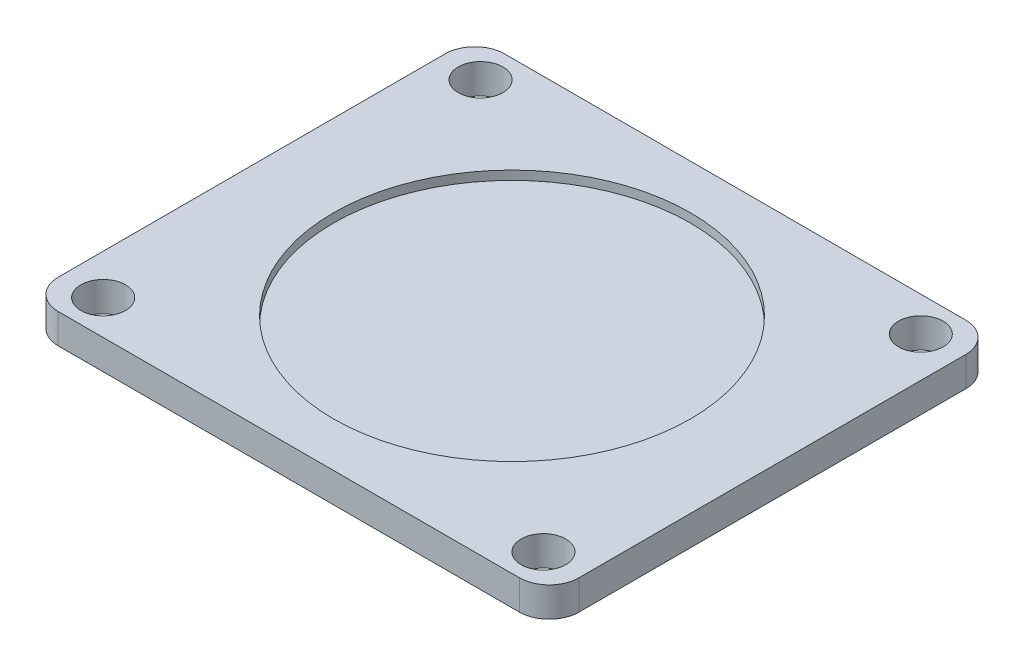
ISO-10303-21;
HEADER;
FILE_DESCRIPTION(('STEP AP214'),'2;1');
FILE_NAME('part.step','',(''),(''),'','','');
FILE_SCHEMA(('AUTOMOTIVE_DESIGN { 1 0 10303 214 1 1 1 1 }'));
ENDSEC;
DATA;
#1=APPLICATION_CONTEXT('core data for automotive mechanical design processes');
#2=APPLICATION_PROTOCOL_DEFINITION('international standard','automotive_design',2000,#1);
#3=PRODUCT_CONTEXT('',#1,'mechanical');
#4=PRODUCT('Part','Part','',(#3));
#5=PRODUCT_RELATED_PRODUCT_CATEGORY('part','',(#4));
#6=PRODUCT_DEFINITION_FORMATION('','',#4);
#7=PRODUCT_DEFINITION_CONTEXT('part definition',#1,'design');
#8=PRODUCT_DEFINITION('design','',#6,#7);
#9=PRODUCT_DEFINITION_SHAPE('','',#8);
#10=(LENGTH_UNIT() NAMED_UNIT(*) SI_UNIT(.MILLI.,.METRE.));
#11=(NAMED_UNIT(*) PLANE_ANGLE_UNIT() SI_UNIT($,.RADIAN.));
#12=(NAMED_UNIT(*) SI_UNIT($,.STERADIAN.) SOLID_ANGLE_UNIT());
#13=UNCERTAINTY_MEASURE_WITH_UNIT(LENGTH_MEASURE(1.E-05),#10,'distance_accuracy_value','');
#14=(GEOMETRIC_REPRESENTATION_CONTEXT(3) GLOBAL_UNCERTAINTY_ASSIGNED_CONTEXT((#13)) GLOBAL_UNIT_ASSIGNED_CONTEXT((#10,
#11,#12)) REPRESENTATION_CONTEXT('',''));
#15=CARTESIAN_POINT('',(0.,0.,0.));
#16=DIRECTION('',(0.,0.,1.));
#17=DIRECTION('',(1.,0.,0.));
#18=AXIS2_PLACEMENT_3D('',#15,#16,#17);
#19=CARTESIAN_POINT('',(15.5,2.,13.));
#20=DIRECTION('',(0.,1.,0.));
#21=DIRECTION('',(0.,0.,1.));
#22=AXIS2_PLACEMENT_3D('',#19,#20,#21);
#23=PLANE('',#22);
#24=CARTESIAN_POINT('',(0.,2.,0.));
#25=DIRECTION('',(0.,1.,0.));
#26=DIRECTION('',(0.,0.,1.));
#27=AXIS2_PLACEMENT_3D('',#24,#25,#26);
#28=CIRCLE('',#27,12.);
#29=CARTESIAN_POINT('',(0.,2.,12.));
#30=VERTEX_POINT('',#29);
#31=EDGE_CURVE('E278',#30,#30,#28,.T.);
#32=ORIENTED_EDGE('',*,*,#31,.F.);
#33=EDGE_LOOP('',(#32));
#34=FACE_BOUND('',#33,.T.);
#35=CARTESIAN_POINT('',(14.7962584102807,2.,-12.6825072088121));
#36=DIRECTION('',(0.,1.,0.));
#37=DIRECTION('',(0.,0.,1.));
#38=AXIS2_PLACEMENT_3D('',#35,#36,#37);
#39=CIRCLE('',#38,1.5);
#40=CARTESIAN_POINT('',(14.7962584102807,2.,-11.1825072088121));
#41=VERTEX_POINT('',#40);
#42=EDGE_CURVE('E254',#41,#41,#39,.T.);
#43=ORIENTED_EDGE('',*,*,#42,.F.);
#44=EDGE_LOOP('',(#43));
#45=FACE_BOUND('',#44,.T.);
#46=CARTESIAN_POINT('',(-14.7962584102807,2.,-12.6825072088121));
#47=DIRECTION('',(0.,1.,0.));
#48=DIRECTION('',(0.,0.,1.));
#49=AXIS2_PLACEMENT_3D('',#46,#47,#48);
#50=CIRCLE('',#49,1.5);
#51=CARTESIAN_POINT('',(-14.7962584102807,2.,-11.1825072088121));
#52=VERTEX_POINT('',#51);
#53=EDGE_CURVE('E141',#52,#52,#50,.T.);
#54=ORIENTED_EDGE('',*,*,#53,.F.);
#55=EDGE_LOOP('',(#54));
#56=FACE_BOUND('',#55,.T.);
#57=CARTESIAN_POINT('',(15.5,2.,13.));
#58=DIRECTION('',(0.,1.,0.));
#59=DIRECTION('',(0.,0.,1.));
#60=AXIS2_PLACEMENT_3D('',#57,#58,#59);
#61=CIRCLE('',#60,2.);
#62=CARTESIAN_POINT('',(15.5,2.,15.));
#63=VERTEX_POINT('',#62);
#64=CARTESIAN_POINT('',(17.5,2.,13.));
#65=VERTEX_POINT('',#64);
#66=EDGE_CURVE('E152',#63,#65,#61,.T.);
#67=ORIENTED_EDGE('',*,*,#66,.T.);
#68=DIRECTION('',(0.,0.,-1.));
#69=VECTOR('',#68,1.);
#70=CARTESIAN_POINT('',(17.5,2.,-13.));
#71=LINE('',#70,#69);
#72=CARTESIAN_POINT('',(17.5,2.,-13.));
#73=VERTEX_POINT('',#72);
#74=EDGE_CURVE('E100',#65,#73,#71,.T.);
#75=ORIENTED_EDGE('',*,*,#74,.T.);
#76=CARTESIAN_POINT('',(15.5,2.,-13.));
#77=DIRECTION('',(0.,1.,0.));
#78=DIRECTION('',(0.,0.,1.));
#79=AXIS2_PLACEMENT_3D('',#76,#77,#78);
#80=CIRCLE('',#79,2.);
#81=CARTESIAN_POINT('',(15.5,2.,-15.));
#82=VERTEX_POINT('',#81);
#83=EDGE_CURVE('E237',#73,#82,#80,.T.);
#84=ORIENTED_EDGE('',*,*,#83,.T.);
#85=DIRECTION('',(-1.,0.,0.));
#86=VECTOR('',#85,1.);
#87=CARTESIAN_POINT('',(-15.5,2.,-15.));
#88=LINE('',#87,#86);
#89=CARTESIAN_POINT('',(-15.5,2.,-15.));
#90=VERTEX_POINT('',#89);
#91=EDGE_CURVE('E239',#82,#90,#88,.T.);
#92=ORIENTED_EDGE('',*,*,#91,.T.);
#93=CARTESIAN_POINT('',(-15.5,2.,-13.));
#94=DIRECTION('',(0.,1.,0.));
#95=DIRECTION('',(0.,0.,-1.));
#96=AXIS2_PLACEMENT_3D('',#93,#94,#95);
#97=CIRCLE('',#96,2.);
#98=CARTESIAN_POINT('',(-17.5,2.,-13.));
#99=VERTEX_POINT('',#98);
#100=EDGE_CURVE('E119',#90,#99,#97,.T.);
#101=ORIENTED_EDGE('',*,*,#100,.T.);
#102=DIRECTION('',(0.,0.,1.));
#103=VECTOR('',#102,1.);
#104=CARTESIAN_POINT('',(-17.5,2.,-13.));
#105=LINE('',#104,#103);
#106=CARTESIAN_POINT('',(-17.5,2.,13.));
#107=VERTEX_POINT('',#106);
#108=EDGE_CURVE('E113',#99,#107,#105,.T.);
#109=ORIENTED_EDGE('',*,*,#108,.T.);
#110=CARTESIAN_POINT('',(-15.5,2.,13.));
#111=DIRECTION('',(0.,1.,0.));
#112=DIRECTION('',(0.,0.,1.));
#113=AXIS2_PLACEMENT_3D('',#110,#111,#112);
#114=CIRCLE('',#113,2.);
#115=CARTESIAN_POINT('',(-15.5,2.,15.));
#116=VERTEX_POINT('',#115);
#117=EDGE_CURVE('E117',#107,#116,#114,.T.);
#118=ORIENTED_EDGE('',*,*,#117,.T.);
#119=DIRECTION('',(1.,0.,0.));
#120=VECTOR('',#119,1.);
#121=CARTESIAN_POINT('',(-15.5,2.,15.));
#122=LINE('',#121,#120);
#123=EDGE_CURVE('E56',#116,#63,#122,.T.);
#124=ORIENTED_EDGE('',*,*,#123,.T.);
#125=EDGE_LOOP('',(#67,#75,#84,#92,#101,#109,#118,#124));
#126=FACE_BOUND('',#125,.T.);
#127=CARTESIAN_POINT('',(-14.7962584102807,2.,12.6825072088121));
#128=DIRECTION('',(0.,1.,0.));
#129=DIRECTION('',(0.,0.,1.));
#130=AXIS2_PLACEMENT_3D('',#127,#128,#129);
#131=CIRCLE('',#130,1.5);
#132=CARTESIAN_POINT('',(-14.7962584102807,2.,14.1825072088121));
#133=VERTEX_POINT('',#132);
#134=EDGE_CURVE('E248',#133,#133,#131,.T.);
#135=ORIENTED_EDGE('',*,*,#134,.F.);
#136=EDGE_LOOP('',(#135));
#137=FACE_BOUND('',#136,.T.);
#138=CARTESIAN_POINT('',(14.7962584102807,2.,12.6825072088121));
#139=DIRECTION('',(0.,1.,0.));
#140=DIRECTION('',(0.,0.,1.));
#141=AXIS2_PLACEMENT_3D('',#138,#139,#140);
#142=CIRCLE('',#141,1.5);
#143=CARTESIAN_POINT('',(14.7962584102807,2.,14.1825072088121));
#144=VERTEX_POINT('',#143);
#145=EDGE_CURVE('E260',#144,#144,#142,.T.);
#146=ORIENTED_EDGE('',*,*,#145,.F.);
#147=EDGE_LOOP('',(#146));
#148=FACE_BOUND('',#147,.T.);
#149=ADVANCED_FACE('F39',(#34,#45,#56,#126,#137,#148),#23,.T.);
#150=CARTESIAN_POINT('',(15.5,0.,13.));
#151=DIRECTION('',(0.,1.,0.));
#152=DIRECTION('',(0.,0.,1.));
#153=AXIS2_PLACEMENT_3D('',#150,#151,#152);
#154=PLANE('',#153);
#155=CARTESIAN_POINT('',(0.,0.,0.));
#156=DIRECTION('',(0.,1.,0.));
#157=DIRECTION('',(0.,0.,1.));
#158=AXIS2_PLACEMENT_3D('',#155,#156,#157);
#159=CIRCLE('',#158,12.);
#160=CARTESIAN_POINT('',(0.,0.,12.));
#161=VERTEX_POINT('',#160);
#162=EDGE_CURVE('E167',#161,#161,#159,.F.);
#163=ORIENTED_EDGE('',*,*,#162,.F.);
#164=EDGE_LOOP('',(#163));
#165=FACE_BOUND('',#164,.T.);
#166=CARTESIAN_POINT('',(15.5,0.,13.));
#167=DIRECTION('',(0.,1.,0.));
#168=DIRECTION('',(0.,0.,1.));
#169=AXIS2_PLACEMENT_3D('',#166,#167,#168);
#170=CIRCLE('',#169,2.);
#171=CARTESIAN_POINT('',(15.5,0.,15.));
#172=VERTEX_POINT('',#171);
#173=CARTESIAN_POINT('',(17.5,0.,13.));
#174=VERTEX_POINT('',#173);
#175=EDGE_CURVE('E137',#172,#174,#170,.T.);
#176=ORIENTED_EDGE('',*,*,#175,.F.);
#177=DIRECTION('',(1.,0.,0.));
#178=VECTOR('',#177,1.);
#179=CARTESIAN_POINT('',(-15.5,0.,15.));
#180=LINE('',#179,#178);
#181=CARTESIAN_POINT('',(-15.5,0.,15.));
#182=VERTEX_POINT('',#181);
#183=EDGE_CURVE('E91',#182,#172,#180,.T.);
#184=ORIENTED_EDGE('',*,*,#183,.F.);
#185=CARTESIAN_POINT('',(-15.5,0.,13.));
#186=DIRECTION('',(0.,1.,0.));
#187=DIRECTION('',(0.,0.,1.));
#188=AXIS2_PLACEMENT_3D('',#185,#186,#187);
#189=CIRCLE('',#188,2.);
#190=CARTESIAN_POINT('',(-17.5,0.,13.));
#191=VERTEX_POINT('',#190);
#192=EDGE_CURVE('E85',#191,#182,#189,.T.);
#193=ORIENTED_EDGE('',*,*,#192,.F.);
#194=DIRECTION('',(0.,0.,1.));
#195=VECTOR('',#194,1.);
#196=CARTESIAN_POINT('',(-17.5,0.,-13.));
#197=LINE('',#196,#195);
#198=CARTESIAN_POINT('',(-17.5,0.,-13.));
#199=VERTEX_POINT('',#198);
#200=EDGE_CURVE('E127',#199,#191,#197,.T.);
#201=ORIENTED_EDGE('',*,*,#200,.F.);
#202=CARTESIAN_POINT('',(-15.5,0.,-13.));
#203=DIRECTION('',(0.,1.,0.));
#204=DIRECTION('',(0.,0.,-1.));
#205=AXIS2_PLACEMENT_3D('',#202,#203,#204);
#206=CIRCLE('',#205,2.);
#207=CARTESIAN_POINT('',(-15.5,0.,-15.));
#208=VERTEX_POINT('',#207);
#209=EDGE_CURVE('E147',#208,#199,#206,.T.);
#210=ORIENTED_EDGE('',*,*,#209,.F.);
#211=DIRECTION('',(-1.,0.,0.));
#212=VECTOR('',#211,1.);
#213=CARTESIAN_POINT('',(-15.5,0.,-15.));
#214=LINE('',#213,#212);
#215=CARTESIAN_POINT('',(15.5,0.,-15.));
#216=VERTEX_POINT('',#215);
#217=EDGE_CURVE('E145',#216,#208,#214,.T.);
#218=ORIENTED_EDGE('',*,*,#217,.F.);
#219=CARTESIAN_POINT('',(15.5,0.,-13.));
#220=DIRECTION('',(0.,1.,0.));
#221=DIRECTION('',(0.,0.,1.));
#222=AXIS2_PLACEMENT_3D('',#219,#220,#221);
#223=CIRCLE('',#222,2.);
#224=CARTESIAN_POINT('',(17.5,0.,-13.));
#225=VERTEX_POINT('',#224);
#226=EDGE_CURVE('E143',#225,#216,#223,.T.);
#227=ORIENTED_EDGE('',*,*,#226,.F.);
#228=DIRECTION('',(0.,0.,-1.));
#229=VECTOR('',#228,1.);
#230=CARTESIAN_POINT('',(17.5,0.,-13.));
#231=LINE('',#230,#229);
#232=EDGE_CURVE('E140',#174,#225,#231,.T.);
#233=ORIENTED_EDGE('',*,*,#232,.F.);
#234=EDGE_LOOP('',(#176,#184,#193,#201,#210,#218,#227,#233));
#235=FACE_BOUND('',#234,.T.);
#236=CARTESIAN_POINT('',(-14.7962584102807,0.,-12.6825072088121));
#237=DIRECTION('',(0.,1.,0.));
#238=DIRECTION('',(0.,0.,1.));
#239=AXIS2_PLACEMENT_3D('',#236,#237,#238);
#240=CIRCLE('',#239,1.5);
#241=CARTESIAN_POINT('',(-14.7962584102807,0.,-11.1825072088121));
#242=VERTEX_POINT('',#241);
#243=EDGE_CURVE('E245',#242,#242,#240,.T.);
#244=ORIENTED_EDGE('',*,*,#243,.T.);
#245=EDGE_LOOP('',(#244));
#246=FACE_BOUND('',#245,.T.);
#247=CARTESIAN_POINT('',(-14.7962584102807,0.,12.6825072088121));
#248=DIRECTION('',(0.,1.,0.));
#249=DIRECTION('',(0.,0.,1.));
#250=AXIS2_PLACEMENT_3D('',#247,#248,#249);
#251=CIRCLE('',#250,1.5);
#252=CARTESIAN_POINT('',(-14.7962584102807,0.,14.1825072088121));
#253=VERTEX_POINT('',#252);
#254=EDGE_CURVE('E251',#253,#253,#251,.T.);
#255=ORIENTED_EDGE('',*,*,#254,.T.);
#256=EDGE_LOOP('',(#255));
#257=FACE_BOUND('',#256,.T.);
#258=CARTESIAN_POINT('',(14.7962584102807,0.,-12.6825072088121));
#259=DIRECTION('',(0.,1.,0.));
#260=DIRECTION('',(0.,0.,1.));
#261=AXIS2_PLACEMENT_3D('',#258,#259,#260);
#262=CIRCLE('',#261,1.5);
#263=CARTESIAN_POINT('',(14.7962584102807,0.,-11.1825072088121));
#264=VERTEX_POINT('',#263);
#265=EDGE_CURVE('E257',#264,#264,#262,.T.);
#266=ORIENTED_EDGE('',*,*,#265,.T.);
#267=EDGE_LOOP('',(#266));
#268=FACE_BOUND('',#267,.T.);
#269=CARTESIAN_POINT('',(14.7962584102807,0.,12.6825072088121));
#270=DIRECTION('',(0.,1.,0.));
#271=DIRECTION('',(0.,0.,1.));
#272=AXIS2_PLACEMENT_3D('',#269,#270,#271);
#273=CIRCLE('',#272,1.5);
#274=CARTESIAN_POINT('',(14.7962584102807,0.,14.1825072088121));
#275=VERTEX_POINT('',#274);
#276=EDGE_CURVE('E263',#275,#275,#273,.T.);
#277=ORIENTED_EDGE('',*,*,#276,.T.);
#278=EDGE_LOOP('',(#277));
#279=FACE_BOUND('',#278,.T.);
#280=ADVANCED_FACE('F188',(#165,#235,#246,#257,#268,#279),#154,.F.);
#281=CARTESIAN_POINT('',(15.5,2.,13.));
#282=DIRECTION('',(0.,-1.,0.));
#283=DIRECTION('',(0.,0.,-1.));
#284=AXIS2_PLACEMENT_3D('',#281,#282,#283);
#285=CYLINDRICAL_SURFACE('',#284,2.);
#286=ORIENTED_EDGE('',*,*,#175,.T.);
#287=DIRECTION('',(0.,-1.,0.));
#288=VECTOR('',#287,1.);
#289=CARTESIAN_POINT('',(17.5,2.,13.));
#290=LINE('',#289,#288);
#291=EDGE_CURVE('E165',#65,#174,#290,.T.);
#292=ORIENTED_EDGE('',*,*,#291,.F.);
#293=ORIENTED_EDGE('',*,*,#66,.F.);
#294=DIRECTION('',(0.,-1.,0.));
#295=VECTOR('',#294,1.);
#296=CARTESIAN_POINT('',(15.5,2.,15.));
#297=LINE('',#296,#295);
#298=EDGE_CURVE('E133',#63,#172,#297,.T.);
#299=ORIENTED_EDGE('',*,*,#298,.T.);
#300=EDGE_LOOP('',(#286,#292,#293,#299));
#301=FACE_BOUND('',#300,.T.);
#302=ADVANCED_FACE('F194',(#301),#285,.T.);
#303=CARTESIAN_POINT('',(17.5,2.,-13.));
#304=DIRECTION('',(-1.,0.,0.));
#305=DIRECTION('',(0.,0.,1.));
#306=AXIS2_PLACEMENT_3D('',#303,#304,#305);
#307=PLANE('',#306);
#308=ORIENTED_EDGE('',*,*,#232,.T.);
#309=DIRECTION('',(0.,-1.,0.));
#310=VECTOR('',#309,1.);
#311=CARTESIAN_POINT('',(17.5,2.,-13.));
#312=LINE('',#311,#310);
#313=EDGE_CURVE('E162',#73,#225,#312,.T.);
#314=ORIENTED_EDGE('',*,*,#313,.F.);
#315=ORIENTED_EDGE('',*,*,#74,.F.);
#316=ORIENTED_EDGE('',*,*,#291,.T.);
#317=EDGE_LOOP('',(#308,#314,#315,#316));
#318=FACE_BOUND('',#317,.T.);
#319=ADVANCED_FACE('F221',(#318),#307,.F.);
#320=CARTESIAN_POINT('',(15.5,2.,-13.));
#321=DIRECTION('',(0.,-1.,0.));
#322=DIRECTION('',(0.,0.,-1.));
#323=AXIS2_PLACEMENT_3D('',#320,#321,#322);
#324=CYLINDRICAL_SURFACE('',#323,2.);
#325=ORIENTED_EDGE('',*,*,#226,.T.);
#326=DIRECTION('',(0.,-1.,0.));
#327=VECTOR('',#326,1.);
#328=CARTESIAN_POINT('',(15.5,2.,-15.));
#329=LINE('',#328,#327);
#330=EDGE_CURVE('E159',#82,#216,#329,.T.);
#331=ORIENTED_EDGE('',*,*,#330,.F.);
#332=ORIENTED_EDGE('',*,*,#83,.F.);
#333=ORIENTED_EDGE('',*,*,#313,.T.);
#334=EDGE_LOOP('',(#325,#331,#332,#333));
#335=FACE_BOUND('',#334,.T.);
#336=ADVANCED_FACE('F217',(#335),#324,.T.);
#337=CARTESIAN_POINT('',(-15.5,2.,-15.));
#338=DIRECTION('',(0.,0.,1.));
#339=DIRECTION('',(1.,0.,0.));
#340=AXIS2_PLACEMENT_3D('',#337,#338,#339);
#341=PLANE('',#340);
#342=ORIENTED_EDGE('',*,*,#217,.T.);
#343=DIRECTION('',(0.,-1.,0.));
#344=VECTOR('',#343,1.);
#345=CARTESIAN_POINT('',(-15.5,2.,-15.));
#346=LINE('',#345,#344);
#347=EDGE_CURVE('E156',#90,#208,#346,.T.);
#348=ORIENTED_EDGE('',*,*,#347,.F.);
#349=ORIENTED_EDGE('',*,*,#91,.F.);
#350=ORIENTED_EDGE('',*,*,#330,.T.);
#351=EDGE_LOOP('',(#342,#348,#349,#350));
#352=FACE_BOUND('',#351,.T.);
#353=ADVANCED_FACE('F213',(#352),#341,.F.);
#354=CARTESIAN_POINT('',(-15.5,2.,-13.));
#355=DIRECTION('',(0.,-1.,0.));
#356=DIRECTION('',(0.,0.,-1.));
#357=AXIS2_PLACEMENT_3D('',#354,#355,#356);
#358=CYLINDRICAL_SURFACE('',#357,2.);
#359=ORIENTED_EDGE('',*,*,#209,.T.);
#360=DIRECTION('',(0.,-1.,0.));
#361=VECTOR('',#360,1.);
#362=CARTESIAN_POINT('',(-17.5,2.,-13.));
#363=LINE('',#362,#361);
#364=EDGE_CURVE('E128',#99,#199,#363,.T.);
#365=ORIENTED_EDGE('',*,*,#364,.F.);
#366=ORIENTED_EDGE('',*,*,#100,.F.);
#367=ORIENTED_EDGE('',*,*,#347,.T.);
#368=EDGE_LOOP('',(#359,#365,#366,#367));
#369=FACE_BOUND('',#368,.T.);
#370=ADVANCED_FACE('F210',(#369),#358,.T.);
#371=CARTESIAN_POINT('',(-17.5,2.,-13.));
#372=DIRECTION('',(1.,0.,0.));
#373=DIRECTION('',(0.,0.,-1.));
#374=AXIS2_PLACEMENT_3D('',#371,#372,#373);
#375=PLANE('',#374);
#376=ORIENTED_EDGE('',*,*,#200,.T.);
#377=DIRECTION('',(0.,-1.,0.));
#378=VECTOR('',#377,1.);
#379=CARTESIAN_POINT('',(-17.5,2.,13.));
#380=LINE('',#379,#378);
#381=EDGE_CURVE('E124',#107,#191,#380,.T.);
#382=ORIENTED_EDGE('',*,*,#381,.F.);
#383=ORIENTED_EDGE('',*,*,#108,.F.);
#384=ORIENTED_EDGE('',*,*,#364,.T.);
#385=EDGE_LOOP('',(#376,#382,#383,#384));
#386=FACE_BOUND('',#385,.T.);
#387=ADVANCED_FACE('F125',(#386),#375,.F.);
#388=CARTESIAN_POINT('',(-15.5,2.,13.));
#389=DIRECTION('',(0.,-1.,0.));
#390=DIRECTION('',(0.,0.,-1.));
#391=AXIS2_PLACEMENT_3D('',#388,#389,#390);
#392=CYLINDRICAL_SURFACE('',#391,2.);
#393=ORIENTED_EDGE('',*,*,#192,.T.);
#394=DIRECTION('',(0.,-1.,0.));
#395=VECTOR('',#394,1.);
#396=CARTESIAN_POINT('',(-15.5,2.,15.));
#397=LINE('',#396,#395);
#398=EDGE_CURVE('E129',#116,#182,#397,.T.);
#399=ORIENTED_EDGE('',*,*,#398,.F.);
#400=ORIENTED_EDGE('',*,*,#117,.F.);
#401=ORIENTED_EDGE('',*,*,#381,.T.);
#402=EDGE_LOOP('',(#393,#399,#400,#401));
#403=FACE_BOUND('',#402,.T.);
#404=ADVANCED_FACE('F131',(#403),#392,.T.);
#405=CARTESIAN_POINT('',(-15.5,2.,15.));
#406=DIRECTION('',(0.,0.,-1.));
#407=DIRECTION('',(-1.,0.,0.));
#408=AXIS2_PLACEMENT_3D('',#405,#406,#407);
#409=PLANE('',#408);
#410=ORIENTED_EDGE('',*,*,#183,.T.);
#411=ORIENTED_EDGE('',*,*,#298,.F.);
#412=ORIENTED_EDGE('',*,*,#123,.F.);
#413=ORIENTED_EDGE('',*,*,#398,.T.);
#414=EDGE_LOOP('',(#410,#411,#412,#413));
#415=FACE_BOUND('',#414,.T.);
#416=ADVANCED_FACE('F203',(#415),#409,.F.);
#417=CARTESIAN_POINT('',(-14.7962584102807,2.,-12.6825072088121));
#418=DIRECTION('',(0.,-1.,0.));
#419=DIRECTION('',(0.,0.,-1.));
#420=AXIS2_PLACEMENT_3D('',#417,#418,#419);
#421=CYLINDRICAL_SURFACE('',#420,1.5);
#422=ORIENTED_EDGE('',*,*,#53,.T.);
#423=EDGE_LOOP('',(#422));
#424=FACE_BOUND('',#423,.T.);
#425=ORIENTED_EDGE('',*,*,#243,.F.);
#426=EDGE_LOOP('',(#425));
#427=FACE_BOUND('',#426,.T.);
#428=ADVANCED_FACE('F200',(#424,#427),#421,.F.);
#429=CARTESIAN_POINT('',(-14.7962584102807,2.,12.6825072088121));
#430=DIRECTION('',(0.,-1.,0.));
#431=DIRECTION('',(0.,0.,-1.));
#432=AXIS2_PLACEMENT_3D('',#429,#430,#431);
#433=CYLINDRICAL_SURFACE('',#432,1.5);
#434=ORIENTED_EDGE('',*,*,#134,.T.);
#435=EDGE_LOOP('',(#434));
#436=FACE_BOUND('',#435,.T.);
#437=ORIENTED_EDGE('',*,*,#254,.F.);
#438=EDGE_LOOP('',(#437));
#439=FACE_BOUND('',#438,.T.);
#440=ADVANCED_FACE('F311',(#436,#439),#433,.F.);
#441=CARTESIAN_POINT('',(14.7962584102807,2.,-12.6825072088121));
#442=DIRECTION('',(0.,-1.,0.));
#443=DIRECTION('',(0.,0.,-1.));
#444=AXIS2_PLACEMENT_3D('',#441,#442,#443);
#445=CYLINDRICAL_SURFACE('',#444,1.5);
#446=ORIENTED_EDGE('',*,*,#42,.T.);
#447=EDGE_LOOP('',(#446));
#448=FACE_BOUND('',#447,.T.);
#449=ORIENTED_EDGE('',*,*,#265,.F.);
#450=EDGE_LOOP('',(#449));
#451=FACE_BOUND('',#450,.T.);
#452=ADVANCED_FACE('F308',(#448,#451),#445,.F.);
#453=CARTESIAN_POINT('',(14.7962584102807,2.,12.6825072088121));
#454=DIRECTION('',(0.,-1.,0.));
#455=DIRECTION('',(0.,0.,-1.));
#456=AXIS2_PLACEMENT_3D('',#453,#454,#455);
#457=CYLINDRICAL_SURFACE('',#456,1.5);
#458=ORIENTED_EDGE('',*,*,#145,.T.);
#459=EDGE_LOOP('',(#458));
#460=FACE_BOUND('',#459,.T.);
#461=ORIENTED_EDGE('',*,*,#276,.F.);
#462=EDGE_LOOP('',(#461));
#463=FACE_BOUND('',#462,.T.);
#464=ADVANCED_FACE('F304',(#460,#463),#457,.F.);
#465=CARTESIAN_POINT('',(0.,-2.,0.));
#466=DIRECTION('',(0.,1.,0.));
#467=DIRECTION('',(0.,0.,1.));
#468=AXIS2_PLACEMENT_3D('',#465,#466,#467);
#469=CYLINDRICAL_SURFACE('',#468,12.);
#470=CARTESIAN_POINT('',(0.,-0.999999999999999,0.));
#471=DIRECTION('',(0.,-1.,0.));
#472=DIRECTION('',(0.,0.,-1.));
#473=AXIS2_PLACEMENT_3D('',#470,#471,#472);
#474=CIRCLE('',#473,12.);
#475=CARTESIAN_POINT('',(0.,-0.999999999999999,-12.));
#476=VERTEX_POINT('',#475);
#477=EDGE_CURVE('E266',#476,#476,#474,.F.);
#478=ORIENTED_EDGE('',*,*,#477,.T.);
#479=EDGE_LOOP('',(#478));
#480=FACE_BOUND('',#479,.T.);
#481=ORIENTED_EDGE('',*,*,#162,.T.);
#482=EDGE_LOOP('',(#481));
#483=FACE_BOUND('',#482,.T.);
#484=ADVANCED_FACE('F297',(#480,#483),#469,.T.);
#485=CARTESIAN_POINT('',(0.,-1.5,0.));
#486=DIRECTION('',(0.,1.,0.));
#487=DIRECTION('',(0.,0.,1.));
#488=AXIS2_PLACEMENT_3D('',#485,#486,#487);
#489=TOROIDAL_SURFACE('',#488,12.,0.500000000000001);
#490=CARTESIAN_POINT('',(0.,-2.,0.));
#491=DIRECTION('',(0.,1.,0.));
#492=DIRECTION('',(0.,0.,1.));
#493=AXIS2_PLACEMENT_3D('',#490,#491,#492);
#494=CIRCLE('',#493,12.);
#495=CARTESIAN_POINT('',(0.,-2.,12.));
#496=VERTEX_POINT('',#495);
#497=EDGE_CURVE('E271',#496,#496,#494,.T.);
#498=ORIENTED_EDGE('',*,*,#497,.T.);
#499=EDGE_LOOP('',(#498));
#500=FACE_BOUND('',#499,.T.);
#501=ORIENTED_EDGE('',*,*,#477,.F.);
#502=EDGE_LOOP('',(#501));
#503=FACE_BOUND('',#502,.T.);
#504=ADVANCED_FACE('F294',(#500,#503),#489,.T.);
#505=CARTESIAN_POINT('',(0.,-2.,0.));
#506=DIRECTION('',(0.,-1.,0.));
#507=DIRECTION('',(0.,0.,-1.));
#508=AXIS2_PLACEMENT_3D('',#505,#506,#507);
#509=PLANE('',#508);
#510=CARTESIAN_POINT('',(0.,-2.,0.));
#511=DIRECTION('',(0.,-1.,0.));
#512=DIRECTION('',(0.,0.,-1.));
#513=AXIS2_PLACEMENT_3D('',#510,#511,#512);
#514=CIRCLE('',#513,2.);
#515=CARTESIAN_POINT('',(0.,-2.,-2.));
#516=VERTEX_POINT('',#515);
#517=EDGE_CURVE('E274',#516,#516,#514,.T.);
#518=ORIENTED_EDGE('',*,*,#517,.F.);
#519=EDGE_LOOP('',(#518));
#520=FACE_BOUND('',#519,.T.);
#521=ORIENTED_EDGE('',*,*,#497,.F.);
#522=EDGE_LOOP('',(#521));
#523=FACE_BOUND('',#522,.T.);
#524=ADVANCED_FACE('F292',(#520,#523),#509,.T.);
#525=CARTESIAN_POINT('',(0.,-6.04073594406932,0.));
#526=DIRECTION('',(0.,1.,0.));
#527=DIRECTION('',(0.,0.,1.));
#528=AXIS2_PLACEMENT_3D('',#525,#526,#527);
#529=CYLINDRICAL_SURFACE('',#528,2.);
#530=CARTESIAN_POINT('',(0.,-5.04073594406932,0.));
#531=DIRECTION('',(0.,-1.,0.));
#532=DIRECTION('',(0.,0.,-1.));
#533=AXIS2_PLACEMENT_3D('',#530,#531,#532);
#534=CIRCLE('',#533,2.);
#535=CARTESIAN_POINT('',(0.,-5.04073594406932,-2.));
#536=VERTEX_POINT('',#535);
#537=EDGE_CURVE('E11',#536,#536,#534,.F.);
#538=ORIENTED_EDGE('',*,*,#537,.T.);
#539=EDGE_LOOP('',(#538));
#540=FACE_BOUND('',#539,.T.);
#541=ORIENTED_EDGE('',*,*,#517,.T.);
#542=EDGE_LOOP('',(#541));
#543=FACE_BOUND('',#542,.T.);
#544=ADVANCED_FACE('F184',(#540,#543),#529,.T.);
#545=CARTESIAN_POINT('',(0.,-6.04073594406932,0.));
#546=DIRECTION('',(0.,-1.,0.));
#547=DIRECTION('',(0.,0.,-1.));
#548=AXIS2_PLACEMENT_3D('',#545,#546,#547);
#549=PLANE('',#548);
#550=CARTESIAN_POINT('',(0.,-6.04073594406932,0.));
#551=DIRECTION('',(0.,-1.,0.));
#552=DIRECTION('',(0.,0.,-1.));
#553=AXIS2_PLACEMENT_3D('',#550,#551,#552);
#554=CIRCLE('',#553,1.);
#555=CARTESIAN_POINT('',(0.,-6.04073594406932,-1.));
#556=VERTEX_POINT('',#555);
#557=EDGE_CURVE('E48',#556,#556,#554,.T.);
#558=ORIENTED_EDGE('',*,*,#557,.T.);
#559=EDGE_LOOP('',(#558));
#560=FACE_BOUND('',#559,.T.);
#561=ADVANCED_FACE('F172',(#560),#549,.T.);
#562=CARTESIAN_POINT('',(0.,-5.04073594406932,0.));
#563=DIRECTION('',(0.,-1.,0.));
#564=DIRECTION('',(0.,0.,-1.));
#565=AXIS2_PLACEMENT_3D('',#562,#563,#564);
#566=DEGENERATE_TOROIDAL_SURFACE('',#565,1.,1.,.T.);
#567=ORIENTED_EDGE('',*,*,#537,.F.);
#568=EDGE_LOOP('',(#567));
#569=FACE_BOUND('',#568,.T.);
#570=ORIENTED_EDGE('',*,*,#557,.F.);
#571=EDGE_LOOP('',(#570));
#572=FACE_BOUND('',#571,.T.);
#573=ADVANCED_FACE('F41',(#569,#572),#566,.T.);
#574=CARTESIAN_POINT('',(0.,1.4,0.));
#575=DIRECTION('',(0.,1.,0.));
#576=DIRECTION('',(0.,0.,1.));
#577=AXIS2_PLACEMENT_3D('',#574,#575,#576);
#578=CYLINDRICAL_SURFACE('',#577,12.);
#579=CARTESIAN_POINT('',(0.,1.4,0.));
#580=DIRECTION('',(0.,1.,0.));
#581=DIRECTION('',(0.,0.,1.));
#582=AXIS2_PLACEMENT_3D('',#579,#580,#581);
#583=CIRCLE('',#582,12.);
#584=CARTESIAN_POINT('',(0.,1.4,12.));
#585=VERTEX_POINT('',#584);
#586=EDGE_CURVE('E277',#585,#585,#583,.T.);
#587=ORIENTED_EDGE('',*,*,#586,.F.);
#588=EDGE_LOOP('',(#587));
#589=FACE_BOUND('',#588,.T.);
#590=ORIENTED_EDGE('',*,*,#31,.T.);
#591=EDGE_LOOP('',(#590));
#592=FACE_BOUND('',#591,.T.);
#593=ADVANCED_FACE('F175',(#589,#592),#578,.F.);
#594=CARTESIAN_POINT('',(0.,1.4,0.));
#595=DIRECTION('',(0.,1.,0.));
#596=DIRECTION('',(0.,0.,1.));
#597=AXIS2_PLACEMENT_3D('',#594,#595,#596);
#598=PLANE('',#597);
#599=ORIENTED_EDGE('',*,*,#586,.T.);
#600=EDGE_LOOP('',(#599));
#601=FACE_BOUND('',#600,.T.);
#602=ADVANCED_FACE('F181',(#601),#598,.T.);
#603=CLOSED_SHELL('',(#149,#280,#302,#319,#336,#353,#370,#387,#404,#416,#428,#440,#452,#464,
#484,#504,#524,#544,#561,#573,#593,#602));
#604=MANIFOLD_SOLID_BREP('B2',#603);
#605=ADVANCED_BREP_SHAPE_REPRESENTATION('',(#18,#604),#14);
#606=SHAPE_DEFINITION_REPRESENTATION(#9,#605);
ENDSEC;
END-ISO-10303-21;
